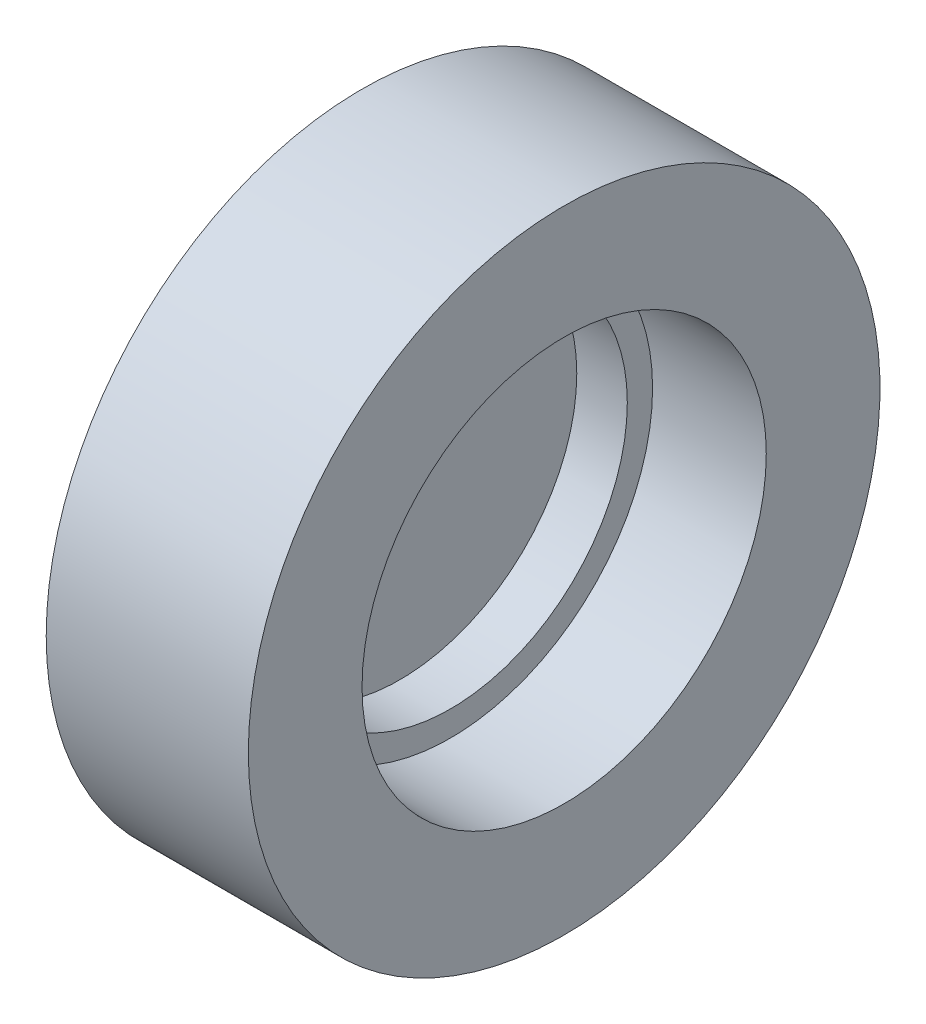
ISO-10303-21;
HEADER;
FILE_DESCRIPTION(('STEP AP214'),'2;1');
FILE_NAME('part.step','',(''),(''),'','','');
FILE_SCHEMA(('AUTOMOTIVE_DESIGN { 1 0 10303 214 1 1 1 1 }'));
ENDSEC;
DATA;
#1=APPLICATION_CONTEXT('core data for automotive mechanical design processes');
#2=APPLICATION_PROTOCOL_DEFINITION('international standard','automotive_design',2000,#1);
#3=PRODUCT_CONTEXT('',#1,'mechanical');
#4=PRODUCT('Part','Part','',(#3));
#5=PRODUCT_RELATED_PRODUCT_CATEGORY('part','',(#4));
#6=PRODUCT_DEFINITION_FORMATION('','',#4);
#7=PRODUCT_DEFINITION_CONTEXT('part definition',#1,'design');
#8=PRODUCT_DEFINITION('design','',#6,#7);
#9=PRODUCT_DEFINITION_SHAPE('','',#8);
#10=(LENGTH_UNIT() NAMED_UNIT(*) SI_UNIT(.MILLI.,.METRE.));
#11=(NAMED_UNIT(*) PLANE_ANGLE_UNIT() SI_UNIT($,.RADIAN.));
#12=(NAMED_UNIT(*) SI_UNIT($,.STERADIAN.) SOLID_ANGLE_UNIT());
#13=UNCERTAINTY_MEASURE_WITH_UNIT(LENGTH_MEASURE(1.E-05),#10,'distance_accuracy_value','');
#14=(GEOMETRIC_REPRESENTATION_CONTEXT(3) GLOBAL_UNCERTAINTY_ASSIGNED_CONTEXT((#13)) GLOBAL_UNIT_ASSIGNED_CONTEXT((#10,
#11,#12)) REPRESENTATION_CONTEXT('',''));
#15=CARTESIAN_POINT('',(0.,0.,0.));
#16=DIRECTION('',(0.,0.,1.));
#17=DIRECTION('',(1.,0.,0.));
#18=AXIS2_PLACEMENT_3D('',#15,#16,#17);
#19=CARTESIAN_POINT('',(0.,0.,0.));
#20=DIRECTION('',(1.,0.,0.));
#21=DIRECTION('',(0.,0.,-1.));
#22=AXIS2_PLACEMENT_3D('',#19,#20,#21);
#23=PLANE('',#22);
#24=CARTESIAN_POINT('',(0.,0.,0.));
#25=DIRECTION('',(-1.,0.,0.));
#26=DIRECTION('',(0.,0.,1.));
#27=AXIS2_PLACEMENT_3D('',#24,#25,#26);
#28=CIRCLE('',#27,25.);
#29=CARTESIAN_POINT('',(0.,0.,25.));
#30=VERTEX_POINT('',#29);
#31=EDGE_CURVE('E10',#30,#30,#28,.T.);
#32=ORIENTED_EDGE('',*,*,#31,.T.);
#33=EDGE_LOOP('',(#32));
#34=FACE_BOUND('',#33,.T.);
#35=ADVANCED_FACE('F30',(#34),#23,.F.);
#36=CARTESIAN_POINT('',(0.,0.,0.));
#37=DIRECTION('',(-1.,0.,0.));
#38=DIRECTION('',(0.,0.,1.));
#39=AXIS2_PLACEMENT_3D('',#36,#37,#38);
#40=CYLINDRICAL_SURFACE('',#39,25.);
#41=ORIENTED_EDGE('',*,*,#31,.F.);
#42=EDGE_LOOP('',(#41));
#43=FACE_BOUND('',#42,.T.);
#44=CARTESIAN_POINT('',(16.,0.,0.));
#45=DIRECTION('',(-1.,0.,0.));
#46=DIRECTION('',(0.,0.,1.));
#47=AXIS2_PLACEMENT_3D('',#44,#45,#46);
#48=CIRCLE('',#47,25.);
#49=CARTESIAN_POINT('',(16.,0.,25.));
#50=VERTEX_POINT('',#49);
#51=EDGE_CURVE('E36',#50,#50,#48,.T.);
#52=ORIENTED_EDGE('',*,*,#51,.T.);
#53=EDGE_LOOP('',(#52));
#54=FACE_BOUND('',#53,.T.);
#55=ADVANCED_FACE('F68',(#43,#54),#40,.T.);
#56=CARTESIAN_POINT('',(16.,25.,0.));
#57=DIRECTION('',(-1.,0.,0.));
#58=DIRECTION('',(0.,0.,1.));
#59=AXIS2_PLACEMENT_3D('',#56,#57,#58);
#60=PLANE('',#59);
#61=ORIENTED_EDGE('',*,*,#51,.F.);
#62=EDGE_LOOP('',(#61));
#63=FACE_BOUND('',#62,.T.);
#64=CARTESIAN_POINT('',(16.,0.,0.));
#65=DIRECTION('',(-1.,0.,0.));
#66=DIRECTION('',(0.,0.,1.));
#67=AXIS2_PLACEMENT_3D('',#64,#65,#66);
#68=CIRCLE('',#67,16.);
#69=CARTESIAN_POINT('',(16.,0.,16.));
#70=VERTEX_POINT('',#69);
#71=EDGE_CURVE('E40',#70,#70,#68,.T.);
#72=ORIENTED_EDGE('',*,*,#71,.T.);
#73=EDGE_LOOP('',(#72));
#74=FACE_BOUND('',#73,.T.);
#75=ADVANCED_FACE('F72',(#63,#74),#60,.F.);
#76=CARTESIAN_POINT('',(0.,0.,0.));
#77=DIRECTION('',(-1.,0.,0.));
#78=DIRECTION('',(0.,0.,1.));
#79=AXIS2_PLACEMENT_3D('',#76,#77,#78);
#80=CYLINDRICAL_SURFACE('',#79,16.);
#81=ORIENTED_EDGE('',*,*,#71,.F.);
#82=EDGE_LOOP('',(#81));
#83=FACE_BOUND('',#82,.T.);
#84=CARTESIAN_POINT('',(7.00000000000001,0.,0.));
#85=DIRECTION('',(-1.,0.,0.));
#86=DIRECTION('',(0.,0.,1.));
#87=AXIS2_PLACEMENT_3D('',#84,#85,#86);
#88=CIRCLE('',#87,16.);
#89=CARTESIAN_POINT('',(7.00000000000001,0.,16.));
#90=VERTEX_POINT('',#89);
#91=EDGE_CURVE('E44',#90,#90,#88,.T.);
#92=ORIENTED_EDGE('',*,*,#91,.T.);
#93=EDGE_LOOP('',(#92));
#94=FACE_BOUND('',#93,.T.);
#95=ADVANCED_FACE('F77',(#83,#94),#80,.F.);
#96=CARTESIAN_POINT('',(7.00000000000001,16.,0.));
#97=DIRECTION('',(-1.,0.,0.));
#98=DIRECTION('',(0.,0.,1.));
#99=AXIS2_PLACEMENT_3D('',#96,#97,#98);
#100=PLANE('',#99);
#101=ORIENTED_EDGE('',*,*,#91,.F.);
#102=EDGE_LOOP('',(#101));
#103=FACE_BOUND('',#102,.T.);
#104=CARTESIAN_POINT('',(7.00000000000001,0.,0.));
#105=DIRECTION('',(-1.,0.,0.));
#106=DIRECTION('',(0.,0.,1.));
#107=AXIS2_PLACEMENT_3D('',#104,#105,#106);
#108=CIRCLE('',#107,14.);
#109=CARTESIAN_POINT('',(7.00000000000001,0.,14.));
#110=VERTEX_POINT('',#109);
#111=EDGE_CURVE('E49',#110,#110,#108,.T.);
#112=ORIENTED_EDGE('',*,*,#111,.T.);
#113=EDGE_LOOP('',(#112));
#114=FACE_BOUND('',#113,.T.);
#115=ADVANCED_FACE('F64',(#103,#114),#100,.F.);
#116=CARTESIAN_POINT('',(0.,0.,0.));
#117=DIRECTION('',(-1.,0.,0.));
#118=DIRECTION('',(0.,0.,1.));
#119=AXIS2_PLACEMENT_3D('',#116,#117,#118);
#120=CYLINDRICAL_SURFACE('',#119,14.);
#121=ORIENTED_EDGE('',*,*,#111,.F.);
#122=EDGE_LOOP('',(#121));
#123=FACE_BOUND('',#122,.T.);
#124=CARTESIAN_POINT('',(3.,0.,0.));
#125=DIRECTION('',(-1.,0.,0.));
#126=DIRECTION('',(0.,0.,1.));
#127=AXIS2_PLACEMENT_3D('',#124,#125,#126);
#128=CIRCLE('',#127,14.);
#129=CARTESIAN_POINT('',(3.,0.,14.));
#130=VERTEX_POINT('',#129);
#131=EDGE_CURVE('E52',#130,#130,#128,.T.);
#132=ORIENTED_EDGE('',*,*,#131,.T.);
#133=EDGE_LOOP('',(#132));
#134=FACE_BOUND('',#133,.T.);
#135=ADVANCED_FACE('F56',(#123,#134),#120,.F.);
#136=CARTESIAN_POINT('',(3.,14.,0.));
#137=DIRECTION('',(-1.,0.,0.));
#138=DIRECTION('',(0.,0.,1.));
#139=AXIS2_PLACEMENT_3D('',#136,#137,#138);
#140=PLANE('',#139);
#141=ORIENTED_EDGE('',*,*,#131,.F.);
#142=EDGE_LOOP('',(#141));
#143=FACE_BOUND('',#142,.T.);
#144=ADVANCED_FACE('F58',(#143),#140,.F.);
#145=CLOSED_SHELL('',(#35,#55,#75,#95,#115,#135,#144));
#146=MANIFOLD_SOLID_BREP('B2',#145);
#147=ADVANCED_BREP_SHAPE_REPRESENTATION('',(#18,#146),#14);
#148=SHAPE_DEFINITION_REPRESENTATION(#9,#147);
ENDSEC;
END-ISO-10303-21;
